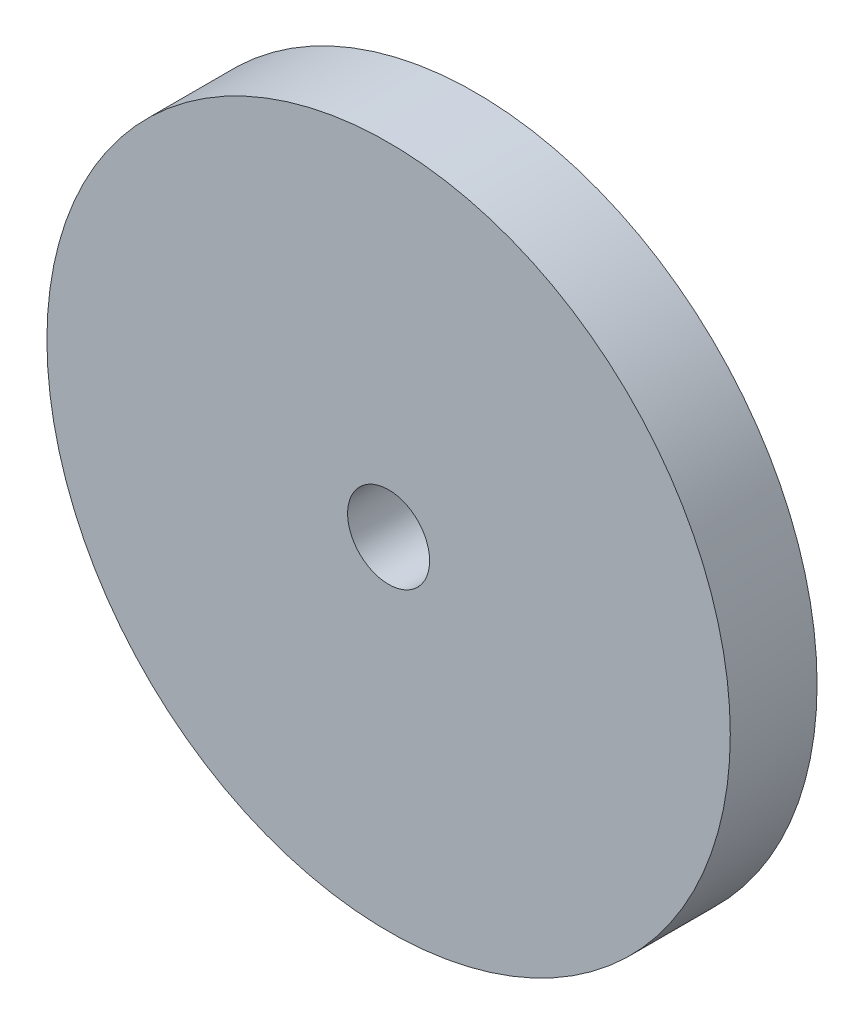
ISO-10303-21;
HEADER;
FILE_DESCRIPTION(('STEP AP214'),'2;1');
FILE_NAME('part.step','',(''),(''),'','','');
FILE_SCHEMA(('AUTOMOTIVE_DESIGN { 1 0 10303 214 1 1 1 1 }'));
ENDSEC;
DATA;
#1=APPLICATION_CONTEXT('core data for automotive mechanical design processes');
#2=APPLICATION_PROTOCOL_DEFINITION('international standard','automotive_design',2000,#1);
#3=PRODUCT_CONTEXT('',#1,'mechanical');
#4=PRODUCT('Part','Part','',(#3));
#5=PRODUCT_RELATED_PRODUCT_CATEGORY('part','',(#4));
#6=PRODUCT_DEFINITION_FORMATION('','',#4);
#7=PRODUCT_DEFINITION_CONTEXT('part definition',#1,'design');
#8=PRODUCT_DEFINITION('design','',#6,#7);
#9=PRODUCT_DEFINITION_SHAPE('','',#8);
#10=(LENGTH_UNIT() NAMED_UNIT(*) SI_UNIT(.MILLI.,.METRE.));
#11=(NAMED_UNIT(*) PLANE_ANGLE_UNIT() SI_UNIT($,.RADIAN.));
#12=(NAMED_UNIT(*) SI_UNIT($,.STERADIAN.) SOLID_ANGLE_UNIT());
#13=UNCERTAINTY_MEASURE_WITH_UNIT(LENGTH_MEASURE(1.E-05),#10,'distance_accuracy_value','');
#14=(GEOMETRIC_REPRESENTATION_CONTEXT(3) GLOBAL_UNCERTAINTY_ASSIGNED_CONTEXT((#13)) GLOBAL_UNIT_ASSIGNED_CONTEXT((#10,
#11,#12)) REPRESENTATION_CONTEXT('',''));
#15=CARTESIAN_POINT('',(0.,0.,0.));
#16=DIRECTION('',(0.,0.,1.));
#17=DIRECTION('',(1.,0.,0.));
#18=AXIS2_PLACEMENT_3D('',#15,#16,#17);
#19=CARTESIAN_POINT('',(0.,0.,6.35));
#20=DIRECTION('',(0.,0.,1.));
#21=DIRECTION('',(1.,0.,0.));
#22=AXIS2_PLACEMENT_3D('',#19,#20,#21);
#23=PLANE('',#22);
#24=CARTESIAN_POINT('',(0.,0.,6.35));
#25=DIRECTION('',(0.,0.,1.));
#26=DIRECTION('',(1.,0.,0.));
#27=AXIS2_PLACEMENT_3D('',#24,#25,#26);
#28=CIRCLE('',#27,25.);
#29=CARTESIAN_POINT('',(25.,0.,6.35));
#30=VERTEX_POINT('',#29);
#31=EDGE_CURVE('E10',#30,#30,#28,.T.);
#32=ORIENTED_EDGE('',*,*,#31,.T.);
#33=EDGE_LOOP('',(#32));
#34=FACE_BOUND('',#33,.T.);
#35=CARTESIAN_POINT('',(0.,0.,6.35));
#36=DIRECTION('',(0.,0.,1.));
#37=DIRECTION('',(1.,0.,0.));
#38=AXIS2_PLACEMENT_3D('',#35,#36,#37);
#39=CIRCLE('',#38,3.);
#40=CARTESIAN_POINT('',(3.,0.,6.35));
#41=VERTEX_POINT('',#40);
#42=EDGE_CURVE('E42',#41,#41,#39,.T.);
#43=ORIENTED_EDGE('',*,*,#42,.F.);
#44=EDGE_LOOP('',(#43));
#45=FACE_BOUND('',#44,.T.);
#46=ADVANCED_FACE('F31',(#34,#45),#23,.T.);
#47=CARTESIAN_POINT('',(0.,0.,0.));
#48=DIRECTION('',(0.,0.,1.));
#49=DIRECTION('',(1.,0.,0.));
#50=AXIS2_PLACEMENT_3D('',#47,#48,#49);
#51=PLANE('',#50);
#52=CARTESIAN_POINT('',(0.,0.,0.));
#53=DIRECTION('',(0.,0.,1.));
#54=DIRECTION('',(1.,0.,0.));
#55=AXIS2_PLACEMENT_3D('',#52,#53,#54);
#56=CIRCLE('',#55,25.);
#57=CARTESIAN_POINT('',(25.,0.,0.));
#58=VERTEX_POINT('',#57);
#59=EDGE_CURVE('E35',#58,#58,#56,.T.);
#60=ORIENTED_EDGE('',*,*,#59,.F.);
#61=EDGE_LOOP('',(#60));
#62=FACE_BOUND('',#61,.T.);
#63=CARTESIAN_POINT('',(0.,0.,0.));
#64=DIRECTION('',(0.,0.,1.));
#65=DIRECTION('',(1.,0.,0.));
#66=AXIS2_PLACEMENT_3D('',#63,#64,#65);
#67=CIRCLE('',#66,3.);
#68=CARTESIAN_POINT('',(3.,0.,0.));
#69=VERTEX_POINT('',#68);
#70=EDGE_CURVE('E44',#69,#69,#67,.T.);
#71=ORIENTED_EDGE('',*,*,#70,.T.);
#72=EDGE_LOOP('',(#71));
#73=FACE_BOUND('',#72,.T.);
#74=ADVANCED_FACE('F54',(#62,#73),#51,.F.);
#75=CARTESIAN_POINT('',(0.,0.,6.35));
#76=DIRECTION('',(0.,0.,-1.));
#77=DIRECTION('',(-1.,0.,0.));
#78=AXIS2_PLACEMENT_3D('',#75,#76,#77);
#79=CYLINDRICAL_SURFACE('',#78,25.);
#80=ORIENTED_EDGE('',*,*,#31,.F.);
#81=EDGE_LOOP('',(#80));
#82=FACE_BOUND('',#81,.T.);
#83=ORIENTED_EDGE('',*,*,#59,.T.);
#84=EDGE_LOOP('',(#83));
#85=FACE_BOUND('',#84,.T.);
#86=ADVANCED_FACE('F33',(#82,#85),#79,.T.);
#87=CARTESIAN_POINT('',(0.,0.,6.35));
#88=DIRECTION('',(0.,0.,-1.));
#89=DIRECTION('',(-1.,0.,0.));
#90=AXIS2_PLACEMENT_3D('',#87,#88,#89);
#91=CYLINDRICAL_SURFACE('',#90,3.);
#92=ORIENTED_EDGE('',*,*,#42,.T.);
#93=EDGE_LOOP('',(#92));
#94=FACE_BOUND('',#93,.T.);
#95=ORIENTED_EDGE('',*,*,#70,.F.);
#96=EDGE_LOOP('',(#95));
#97=FACE_BOUND('',#96,.T.);
#98=ADVANCED_FACE('F50',(#94,#97),#91,.F.);
#99=CLOSED_SHELL('',(#46,#74,#86,#98));
#100=MANIFOLD_SOLID_BREP('B2',#99);
#101=ADVANCED_BREP_SHAPE_REPRESENTATION('',(#18,#100),#14);
#102=SHAPE_DEFINITION_REPRESENTATION(#9,#101);
ENDSEC;
END-ISO-10303-21;
